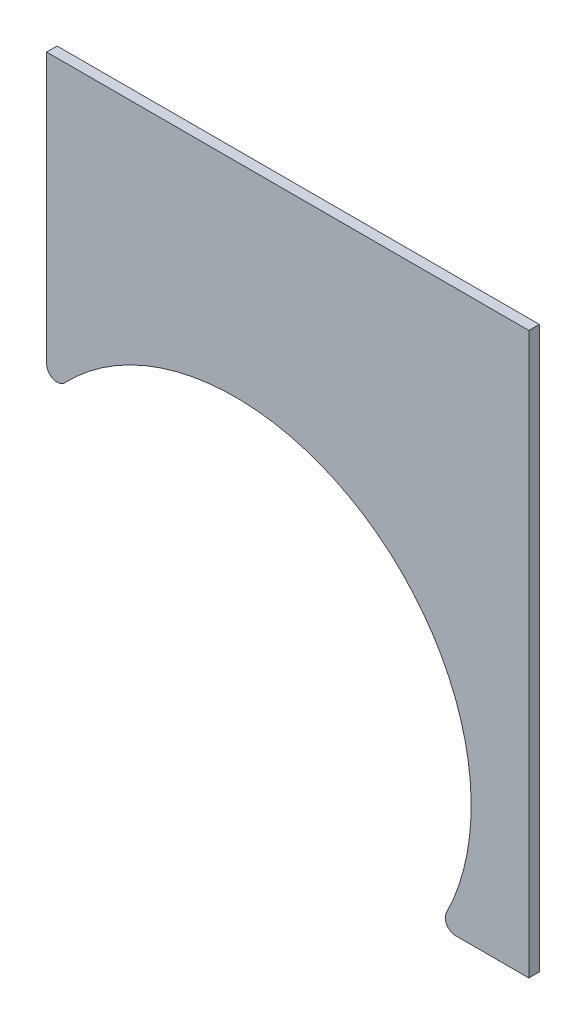
ISO-10303-21;
HEADER;
FILE_DESCRIPTION(('STEP AP214'),'2;1');
FILE_NAME('part.step','',(''),(''),'','','');
FILE_SCHEMA(('AUTOMOTIVE_DESIGN { 1 0 10303 214 1 1 1 1 }'));
ENDSEC;
DATA;
#1=APPLICATION_CONTEXT('core data for automotive mechanical design processes');
#2=APPLICATION_PROTOCOL_DEFINITION('international standard','automotive_design',2000,#1);
#3=PRODUCT_CONTEXT('',#1,'mechanical');
#4=PRODUCT('Part','Part','',(#3));
#5=PRODUCT_RELATED_PRODUCT_CATEGORY('part','',(#4));
#6=PRODUCT_DEFINITION_FORMATION('','',#4);
#7=PRODUCT_DEFINITION_CONTEXT('part definition',#1,'design');
#8=PRODUCT_DEFINITION('design','',#6,#7);
#9=PRODUCT_DEFINITION_SHAPE('','',#8);
#10=(LENGTH_UNIT() NAMED_UNIT(*) SI_UNIT(.MILLI.,.METRE.));
#11=(NAMED_UNIT(*) PLANE_ANGLE_UNIT() SI_UNIT($,.RADIAN.));
#12=(NAMED_UNIT(*) SI_UNIT($,.STERADIAN.) SOLID_ANGLE_UNIT());
#13=UNCERTAINTY_MEASURE_WITH_UNIT(LENGTH_MEASURE(1.E-05),#10,'distance_accuracy_value','');
#14=(GEOMETRIC_REPRESENTATION_CONTEXT(3) GLOBAL_UNCERTAINTY_ASSIGNED_CONTEXT((#13)) GLOBAL_UNIT_ASSIGNED_CONTEXT((#10,
#11,#12)) REPRESENTATION_CONTEXT('',''));
#15=CARTESIAN_POINT('',(0.,0.,0.));
#16=DIRECTION('',(0.,0.,1.));
#17=DIRECTION('',(1.,0.,0.));
#18=AXIS2_PLACEMENT_3D('',#15,#16,#17);
#19=CARTESIAN_POINT('',(-36.,84.,2.));
#20=DIRECTION('',(1.,0.,0.));
#21=DIRECTION('',(0.,1.,0.));
#22=AXIS2_PLACEMENT_3D('',#19,#20,#21);
#23=PLANE('',#22);
#24=DIRECTION('',(0.,-1.,0.));
#25=VECTOR('',#24,1.);
#26=CARTESIAN_POINT('',(-36.,84.,0.));
#27=LINE('',#26,#25);
#28=CARTESIAN_POINT('',(-36.,84.,0.));
#29=VERTEX_POINT('',#28);
#30=CARTESIAN_POINT('',(-36.,32.4499614791759,0.));
#31=VERTEX_POINT('',#30);
#32=EDGE_CURVE('E128',#29,#31,#27,.T.);
#33=ORIENTED_EDGE('',*,*,#32,.T.);
#34=DIRECTION('',(0.,0.,-1.));
#35=VECTOR('',#34,1.);
#36=CARTESIAN_POINT('',(-36.,32.4499614791759,2.));
#37=LINE('',#36,#35);
#38=CARTESIAN_POINT('',(-36.,32.4499614791759,2.));
#39=VERTEX_POINT('',#38);
#40=EDGE_CURVE('E11',#31,#39,#37,.F.);
#41=ORIENTED_EDGE('',*,*,#40,.T.);
#42=DIRECTION('',(0.,-1.,0.));
#43=VECTOR('',#42,1.);
#44=CARTESIAN_POINT('',(-36.,84.,2.));
#45=LINE('',#44,#43);
#46=CARTESIAN_POINT('',(-36.,84.,2.));
#47=VERTEX_POINT('',#46);
#48=EDGE_CURVE('E137',#47,#39,#45,.T.);
#49=ORIENTED_EDGE('',*,*,#48,.F.);
#50=DIRECTION('',(0.,0.,-1.));
#51=VECTOR('',#50,1.);
#52=CARTESIAN_POINT('',(-36.,84.,2.));
#53=LINE('',#52,#51);
#54=EDGE_CURVE('E124',#47,#29,#53,.T.);
#55=ORIENTED_EDGE('',*,*,#54,.T.);
#56=EDGE_LOOP('',(#33,#41,#49,#55));
#57=FACE_BOUND('',#56,.T.);
#58=ADVANCED_FACE('F37',(#57),#23,.F.);
#59=CARTESIAN_POINT('',(0.,0.,2.));
#60=DIRECTION('',(0.,0.,-1.));
#61=DIRECTION('',(-1.,0.,0.));
#62=AXIS2_PLACEMENT_3D('',#59,#60,#61);
#63=CYLINDRICAL_SURFACE('',#62,45.);
#64=CARTESIAN_POINT('',(0.,0.,0.));
#65=DIRECTION('',(0.,0.,-1.));
#66=DIRECTION('',(1.,0.,0.));
#67=AXIS2_PLACEMENT_3D('',#64,#65,#66);
#68=CIRCLE('',#67,45.);
#69=CARTESIAN_POINT('',(-32.5531914893617,31.0691120545301,0.));
#70=VERTEX_POINT('',#69);
#71=CARTESIAN_POINT('',(40.2583328456719,-20.1063829787234,0.));
#72=VERTEX_POINT('',#71);
#73=EDGE_CURVE('E130',#70,#72,#68,.T.);
#74=ORIENTED_EDGE('',*,*,#73,.T.);
#75=DIRECTION('',(0.,0.,-1.));
#76=VECTOR('',#75,1.);
#77=CARTESIAN_POINT('',(40.2583328456719,-20.1063829787234,2.));
#78=LINE('',#77,#76);
#79=CARTESIAN_POINT('',(40.2583328456719,-20.1063829787234,2.));
#80=VERTEX_POINT('',#79);
#81=EDGE_CURVE('E58',#72,#80,#78,.F.);
#82=ORIENTED_EDGE('',*,*,#81,.T.);
#83=CARTESIAN_POINT('',(0.,0.,2.));
#84=DIRECTION('',(0.,0.,-1.));
#85=DIRECTION('',(1.,0.,0.));
#86=AXIS2_PLACEMENT_3D('',#83,#84,#85);
#87=CIRCLE('',#86,45.);
#88=CARTESIAN_POINT('',(-32.5531914893617,31.0691120545301,2.));
#89=VERTEX_POINT('',#88);
#90=EDGE_CURVE('E107',#89,#80,#87,.T.);
#91=ORIENTED_EDGE('',*,*,#90,.F.);
#92=DIRECTION('',(0.,0.,-1.));
#93=VECTOR('',#92,1.);
#94=CARTESIAN_POINT('',(-32.5531914893617,31.0691120545301,2.));
#95=LINE('',#94,#93);
#96=EDGE_CURVE('E146',#89,#70,#95,.T.);
#97=ORIENTED_EDGE('',*,*,#96,.T.);
#98=EDGE_LOOP('',(#74,#82,#91,#97));
#99=FACE_BOUND('',#98,.T.);
#100=ADVANCED_FACE('F154',(#99),#63,.F.);
#101=CARTESIAN_POINT('',(38.6781592116274,-23.,2.));
#102=DIRECTION('',(0.,1.,0.));
#103=DIRECTION('',(0.,0.,1.));
#104=AXIS2_PLACEMENT_3D('',#101,#102,#103);
#105=PLANE('',#104);
#106=DIRECTION('',(1.,0.,0.));
#107=VECTOR('',#106,1.);
#108=CARTESIAN_POINT('',(38.6781592116274,-23.,2.));
#109=LINE('',#108,#107);
#110=CARTESIAN_POINT('',(42.0475920832573,-23.,2.));
#111=VERTEX_POINT('',#110);
#112=CARTESIAN_POINT('',(56.,-23.,2.));
#113=VERTEX_POINT('',#112);
#114=EDGE_CURVE('E97',#111,#113,#109,.T.);
#115=ORIENTED_EDGE('',*,*,#114,.F.);
#116=DIRECTION('',(0.,0.,-1.));
#117=VECTOR('',#116,1.);
#118=CARTESIAN_POINT('',(42.0475920832573,-23.,2.));
#119=LINE('',#118,#117);
#120=CARTESIAN_POINT('',(42.0475920832573,-23.,0.));
#121=VERTEX_POINT('',#120);
#122=EDGE_CURVE('E116',#111,#121,#119,.T.);
#123=ORIENTED_EDGE('',*,*,#122,.T.);
#124=DIRECTION('',(1.,0.,0.));
#125=VECTOR('',#124,1.);
#126=CARTESIAN_POINT('',(38.6781592116274,-23.,0.));
#127=LINE('',#126,#125);
#128=CARTESIAN_POINT('',(56.,-23.,0.));
#129=VERTEX_POINT('',#128);
#130=EDGE_CURVE('E113',#121,#129,#127,.T.);
#131=ORIENTED_EDGE('',*,*,#130,.T.);
#132=DIRECTION('',(0.,0.,-1.));
#133=VECTOR('',#132,1.);
#134=CARTESIAN_POINT('',(56.,-23.,2.));
#135=LINE('',#134,#133);
#136=EDGE_CURVE('E110',#113,#129,#135,.T.);
#137=ORIENTED_EDGE('',*,*,#136,.F.);
#138=EDGE_LOOP('',(#115,#123,#131,#137));
#139=FACE_BOUND('',#138,.T.);
#140=ADVANCED_FACE('F111',(#139),#105,.F.);
#141=CARTESIAN_POINT('',(56.,84.,2.));
#142=DIRECTION('',(-1.,0.,0.));
#143=DIRECTION('',(0.,-1.,0.));
#144=AXIS2_PLACEMENT_3D('',#141,#142,#143);
#145=PLANE('',#144);
#146=DIRECTION('',(0.,1.,0.));
#147=VECTOR('',#146,1.);
#148=CARTESIAN_POINT('',(56.,84.,0.));
#149=LINE('',#148,#147);
#150=CARTESIAN_POINT('',(56.,84.,0.));
#151=VERTEX_POINT('',#150);
#152=EDGE_CURVE('E133',#129,#151,#149,.T.);
#153=ORIENTED_EDGE('',*,*,#152,.T.);
#154=DIRECTION('',(0.,0.,-1.));
#155=VECTOR('',#154,1.);
#156=CARTESIAN_POINT('',(56.,84.,2.));
#157=LINE('',#156,#155);
#158=CARTESIAN_POINT('',(56.,84.,2.));
#159=VERTEX_POINT('',#158);
#160=EDGE_CURVE('E117',#159,#151,#157,.T.);
#161=ORIENTED_EDGE('',*,*,#160,.F.);
#162=DIRECTION('',(0.,1.,0.));
#163=VECTOR('',#162,1.);
#164=CARTESIAN_POINT('',(56.,84.,2.));
#165=LINE('',#164,#163);
#166=EDGE_CURVE('E101',#113,#159,#165,.T.);
#167=ORIENTED_EDGE('',*,*,#166,.F.);
#168=ORIENTED_EDGE('',*,*,#136,.T.);
#169=EDGE_LOOP('',(#153,#161,#167,#168));
#170=FACE_BOUND('',#169,.T.);
#171=ADVANCED_FACE('F119',(#170),#145,.F.);
#172=CARTESIAN_POINT('',(-36.,84.,2.));
#173=DIRECTION('',(0.,-1.,0.));
#174=DIRECTION('',(0.,0.,-1.));
#175=AXIS2_PLACEMENT_3D('',#172,#173,#174);
#176=PLANE('',#175);
#177=DIRECTION('',(-1.,0.,0.));
#178=VECTOR('',#177,1.);
#179=CARTESIAN_POINT('',(-36.,84.,0.));
#180=LINE('',#179,#178);
#181=EDGE_CURVE('E135',#151,#29,#180,.T.);
#182=ORIENTED_EDGE('',*,*,#181,.T.);
#183=ORIENTED_EDGE('',*,*,#54,.F.);
#184=DIRECTION('',(-1.,0.,0.));
#185=VECTOR('',#184,1.);
#186=CARTESIAN_POINT('',(-36.,84.,2.));
#187=LINE('',#186,#185);
#188=EDGE_CURVE('E122',#159,#47,#187,.T.);
#189=ORIENTED_EDGE('',*,*,#188,.F.);
#190=ORIENTED_EDGE('',*,*,#160,.T.);
#191=EDGE_LOOP('',(#182,#183,#189,#190));
#192=FACE_BOUND('',#191,.T.);
#193=ADVANCED_FACE('F162',(#192),#176,.F.);
#194=CARTESIAN_POINT('',(0.,0.,2.));
#195=DIRECTION('',(0.,0.,1.));
#196=DIRECTION('',(1.,0.,0.));
#197=AXIS2_PLACEMENT_3D('',#194,#195,#196);
#198=PLANE('',#197);
#199=ORIENTED_EDGE('',*,*,#90,.T.);
#200=CARTESIAN_POINT('',(42.0475920832573,-21.,2.));
#201=DIRECTION('',(0.,0.,1.));
#202=DIRECTION('',(1.,0.,0.));
#203=AXIS2_PLACEMENT_3D('',#200,#201,#202);
#204=CIRCLE('',#203,2.);
#205=EDGE_CURVE('E45',#80,#111,#204,.T.);
#206=ORIENTED_EDGE('',*,*,#205,.T.);
#207=ORIENTED_EDGE('',*,*,#114,.T.);
#208=ORIENTED_EDGE('',*,*,#166,.T.);
#209=ORIENTED_EDGE('',*,*,#188,.T.);
#210=ORIENTED_EDGE('',*,*,#48,.T.);
#211=CARTESIAN_POINT('',(-34.,32.4499614791759,2.));
#212=DIRECTION('',(0.,0.,1.));
#213=DIRECTION('',(1.,0.,0.));
#214=AXIS2_PLACEMENT_3D('',#211,#212,#213);
#215=CIRCLE('',#214,2.);
#216=EDGE_CURVE('E150',#39,#89,#215,.T.);
#217=ORIENTED_EDGE('',*,*,#216,.T.);
#218=EDGE_LOOP('',(#199,#206,#207,#208,#209,#210,#217));
#219=FACE_BOUND('',#218,.T.);
#220=ADVANCED_FACE('F99',(#219),#198,.T.);
#221=CARTESIAN_POINT('',(0.,0.,0.));
#222=DIRECTION('',(0.,0.,1.));
#223=DIRECTION('',(1.,0.,0.));
#224=AXIS2_PLACEMENT_3D('',#221,#222,#223);
#225=PLANE('',#224);
#226=ORIENTED_EDGE('',*,*,#130,.F.);
#227=CARTESIAN_POINT('',(42.0475920832573,-21.,0.));
#228=DIRECTION('',(0.,0.,1.));
#229=DIRECTION('',(1.,0.,0.));
#230=AXIS2_PLACEMENT_3D('',#227,#228,#229);
#231=CIRCLE('',#230,2.);
#232=EDGE_CURVE('E144',#121,#72,#231,.F.);
#233=ORIENTED_EDGE('',*,*,#232,.T.);
#234=ORIENTED_EDGE('',*,*,#73,.F.);
#235=CARTESIAN_POINT('',(-34.,32.4499614791759,0.));
#236=DIRECTION('',(0.,0.,1.));
#237=DIRECTION('',(1.,0.,0.));
#238=AXIS2_PLACEMENT_3D('',#235,#236,#237);
#239=CIRCLE('',#238,2.);
#240=EDGE_CURVE('E142',#70,#31,#239,.F.);
#241=ORIENTED_EDGE('',*,*,#240,.T.);
#242=ORIENTED_EDGE('',*,*,#32,.F.);
#243=ORIENTED_EDGE('',*,*,#181,.F.);
#244=ORIENTED_EDGE('',*,*,#152,.F.);
#245=EDGE_LOOP('',(#226,#233,#234,#241,#242,#243,#244));
#246=FACE_BOUND('',#245,.T.);
#247=ADVANCED_FACE('F158',(#246),#225,.F.);
#248=CARTESIAN_POINT('',(42.0475920832573,-21.,2.));
#249=DIRECTION('',(0.,0.,-1.));
#250=DIRECTION('',(-1.,0.,0.));
#251=AXIS2_PLACEMENT_3D('',#248,#249,#250);
#252=CYLINDRICAL_SURFACE('',#251,2.);
#253=ORIENTED_EDGE('',*,*,#205,.F.);
#254=ORIENTED_EDGE('',*,*,#81,.F.);
#255=ORIENTED_EDGE('',*,*,#232,.F.);
#256=ORIENTED_EDGE('',*,*,#122,.F.);
#257=EDGE_LOOP('',(#253,#254,#255,#256));
#258=FACE_BOUND('',#257,.T.);
#259=ADVANCED_FACE('F164',(#258),#252,.T.);
#260=CARTESIAN_POINT('',(-34.,32.4499614791759,2.));
#261=DIRECTION('',(0.,0.,-1.));
#262=DIRECTION('',(-1.,0.,0.));
#263=AXIS2_PLACEMENT_3D('',#260,#261,#262);
#264=CYLINDRICAL_SURFACE('',#263,2.);
#265=ORIENTED_EDGE('',*,*,#216,.F.);
#266=ORIENTED_EDGE('',*,*,#40,.F.);
#267=ORIENTED_EDGE('',*,*,#240,.F.);
#268=ORIENTED_EDGE('',*,*,#96,.F.);
#269=EDGE_LOOP('',(#265,#266,#267,#268));
#270=FACE_BOUND('',#269,.T.);
#271=ADVANCED_FACE('F39',(#270),#264,.T.);
#272=CLOSED_SHELL('',(#58,#100,#140,#171,#193,#220,#247,#259,#271));
#273=MANIFOLD_SOLID_BREP('B2',#272);
#274=ADVANCED_BREP_SHAPE_REPRESENTATION('',(#18,#273),#14);
#275=SHAPE_DEFINITION_REPRESENTATION(#9,#274);
ENDSEC;
END-ISO-10303-21;
